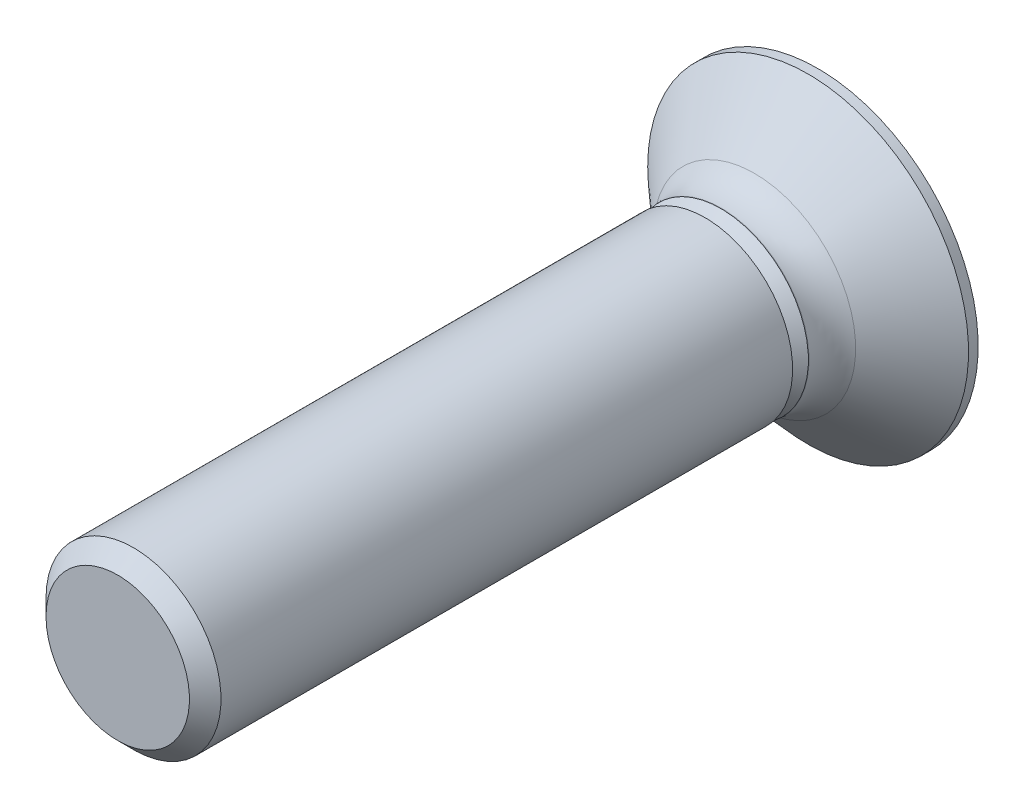
ISO-10303-21;
HEADER;
FILE_DESCRIPTION(('STEP AP214'),'2;1');
FILE_NAME('part.step','',(''),(''),'','','');
FILE_SCHEMA(('AUTOMOTIVE_DESIGN { 1 0 10303 214 1 1 1 1 }'));
ENDSEC;
DATA;
#1=APPLICATION_CONTEXT('core data for automotive mechanical design processes');
#2=APPLICATION_PROTOCOL_DEFINITION('international standard','automotive_design',2000,#1);
#3=PRODUCT_CONTEXT('',#1,'mechanical');
#4=PRODUCT('Part','Part','',(#3));
#5=PRODUCT_RELATED_PRODUCT_CATEGORY('part','',(#4));
#6=PRODUCT_DEFINITION_FORMATION('','',#4);
#7=PRODUCT_DEFINITION_CONTEXT('part definition',#1,'design');
#8=PRODUCT_DEFINITION('design','',#6,#7);
#9=PRODUCT_DEFINITION_SHAPE('','',#8);
#10=(LENGTH_UNIT() NAMED_UNIT(*) SI_UNIT(.MILLI.,.METRE.));
#11=(NAMED_UNIT(*) PLANE_ANGLE_UNIT() SI_UNIT($,.RADIAN.));
#12=(NAMED_UNIT(*) SI_UNIT($,.STERADIAN.) SOLID_ANGLE_UNIT());
#13=UNCERTAINTY_MEASURE_WITH_UNIT(LENGTH_MEASURE(1.E-05),#10,'distance_accuracy_value','');
#14=(GEOMETRIC_REPRESENTATION_CONTEXT(3) GLOBAL_UNCERTAINTY_ASSIGNED_CONTEXT((#13)) GLOBAL_UNIT_ASSIGNED_CONTEXT((#10,
#11,#12)) REPRESENTATION_CONTEXT('',''));
#15=CARTESIAN_POINT('',(0.,0.,0.));
#16=DIRECTION('',(0.,0.,1.));
#17=DIRECTION('',(1.,0.,0.));
#18=AXIS2_PLACEMENT_3D('',#15,#16,#17);
#19=CARTESIAN_POINT('',(0.,2.75,0.));
#20=DIRECTION('',(0.,0.,1.));
#21=DIRECTION('',(1.,0.,0.));
#22=AXIS2_PLACEMENT_3D('',#19,#20,#21);
#23=PLANE('',#22);
#24=CARTESIAN_POINT('',(0.,0.,0.));
#25=DIRECTION('',(0.,0.,-1.));
#26=DIRECTION('',(-1.,0.,0.));
#27=AXIS2_PLACEMENT_3D('',#24,#25,#26);
#28=CIRCLE('',#27,2.75);
#29=CARTESIAN_POINT('',(-2.75,0.,0.));
#30=VERTEX_POINT('',#29);
#31=EDGE_CURVE('E236',#30,#30,#28,.T.);
#32=ORIENTED_EDGE('',*,*,#31,.T.);
#33=EDGE_LOOP('',(#32));
#34=FACE_BOUND('',#33,.T.);
#35=DIRECTION('',(0.422618261740699,0.90630778703665,0.));
#36=VECTOR('',#35,1.);
#37=CARTESIAN_POINT('',(0.266666666666666,-1.6,0.));
#38=LINE('',#37,#36);
#39=CARTESIAN_POINT('',(0.266666666666666,-1.6,0.));
#40=VERTEX_POINT('',#39);
#41=CARTESIAN_POINT('',(0.690686510489199,-0.690686510489199,0.));
#42=VERTEX_POINT('',#41);
#43=EDGE_CURVE('E31',#40,#42,#38,.T.);
#44=ORIENTED_EDGE('',*,*,#43,.T.);
#45=DIRECTION('',(0.90630778703665,0.422618261740699,0.));
#46=VECTOR('',#45,1.);
#47=CARTESIAN_POINT('',(0.690686510489199,-0.690686510489199,0.));
#48=LINE('',#47,#46);
#49=CARTESIAN_POINT('',(1.6,-0.266666666666667,0.));
#50=VERTEX_POINT('',#49);
#51=EDGE_CURVE('E162',#42,#50,#48,.T.);
#52=ORIENTED_EDGE('',*,*,#51,.T.);
#53=DIRECTION('',(0.,1.,0.));
#54=VECTOR('',#53,1.);
#55=CARTESIAN_POINT('',(1.6,-0.266666666666667,0.));
#56=LINE('',#55,#54);
#57=CARTESIAN_POINT('',(1.6,0.266666666666666,0.));
#58=VERTEX_POINT('',#57);
#59=EDGE_CURVE('E158',#50,#58,#56,.T.);
#60=ORIENTED_EDGE('',*,*,#59,.T.);
#61=DIRECTION('',(-0.90630778703665,0.422618261740699,0.));
#62=VECTOR('',#61,1.);
#63=CARTESIAN_POINT('',(1.6,0.266666666666666,0.));
#64=LINE('',#63,#62);
#65=CARTESIAN_POINT('',(0.690686510489199,0.690686510489198,0.));
#66=VERTEX_POINT('',#65);
#67=EDGE_CURVE('E154',#58,#66,#64,.T.);
#68=ORIENTED_EDGE('',*,*,#67,.T.);
#69=DIRECTION('',(-0.422618261740699,0.90630778703665,0.));
#70=VECTOR('',#69,1.);
#71=CARTESIAN_POINT('',(0.690686510489199,0.690686510489198,0.));
#72=LINE('',#71,#70);
#73=CARTESIAN_POINT('',(0.266666666666667,1.6,0.));
#74=VERTEX_POINT('',#73);
#75=EDGE_CURVE('E150',#66,#74,#72,.T.);
#76=ORIENTED_EDGE('',*,*,#75,.T.);
#77=DIRECTION('',(-1.,0.,0.));
#78=VECTOR('',#77,1.);
#79=CARTESIAN_POINT('',(0.266666666666667,1.6,0.));
#80=LINE('',#79,#78);
#81=CARTESIAN_POINT('',(-0.266666666666666,1.6,0.));
#82=VERTEX_POINT('',#81);
#83=EDGE_CURVE('E146',#74,#82,#80,.T.);
#84=ORIENTED_EDGE('',*,*,#83,.T.);
#85=DIRECTION('',(-0.422618261740699,-0.90630778703665,0.));
#86=VECTOR('',#85,1.);
#87=CARTESIAN_POINT('',(-0.266666666666666,1.6,0.));
#88=LINE('',#87,#86);
#89=CARTESIAN_POINT('',(-0.690686510489197,0.690686510489199,0.));
#90=VERTEX_POINT('',#89);
#91=EDGE_CURVE('E142',#82,#90,#88,.T.);
#92=ORIENTED_EDGE('',*,*,#91,.T.);
#93=DIRECTION('',(-0.90630778703665,-0.422618261740699,0.));
#94=VECTOR('',#93,1.);
#95=CARTESIAN_POINT('',(-0.690686510489197,0.690686510489199,0.));
#96=LINE('',#95,#94);
#97=CARTESIAN_POINT('',(-1.6,0.266666666666667,0.));
#98=VERTEX_POINT('',#97);
#99=EDGE_CURVE('E138',#90,#98,#96,.T.);
#100=ORIENTED_EDGE('',*,*,#99,.T.);
#101=DIRECTION('',(0.,-1.,0.));
#102=VECTOR('',#101,1.);
#103=CARTESIAN_POINT('',(-1.6,0.266666666666667,0.));
#104=LINE('',#103,#102);
#105=CARTESIAN_POINT('',(-1.6,-0.266666666666666,0.));
#106=VERTEX_POINT('',#105);
#107=EDGE_CURVE('E133',#98,#106,#104,.T.);
#108=ORIENTED_EDGE('',*,*,#107,.T.);
#109=DIRECTION('',(0.90630778703665,-0.422618261740699,0.));
#110=VECTOR('',#109,1.);
#111=CARTESIAN_POINT('',(-1.6,-0.266666666666666,0.));
#112=LINE('',#111,#110);
#113=CARTESIAN_POINT('',(-0.690686510489199,-0.690686510489198,0.));
#114=VERTEX_POINT('',#113);
#115=EDGE_CURVE('E127',#106,#114,#112,.T.);
#116=ORIENTED_EDGE('',*,*,#115,.T.);
#117=DIRECTION('',(0.4226182617407,-0.90630778703665,0.));
#118=VECTOR('',#117,1.);
#119=CARTESIAN_POINT('',(-0.690686510489199,-0.690686510489198,0.));
#120=LINE('',#119,#118);
#121=CARTESIAN_POINT('',(-0.266666666666666,-1.6,0.));
#122=VERTEX_POINT('',#121);
#123=EDGE_CURVE('E110',#114,#122,#120,.T.);
#124=ORIENTED_EDGE('',*,*,#123,.T.);
#125=DIRECTION('',(1.,0.,0.));
#126=VECTOR('',#125,1.);
#127=CARTESIAN_POINT('',(-0.266666666666666,-1.6,0.));
#128=LINE('',#127,#126);
#129=EDGE_CURVE('E119',#122,#40,#128,.T.);
#130=ORIENTED_EDGE('',*,*,#129,.T.);
#131=EDGE_LOOP('',(#44,#52,#60,#68,#76,#84,#92,#100,#108,#116,#124,#130));
#132=FACE_BOUND('',#131,.T.);
#133=ADVANCED_FACE('F16',(#34,#132),#23,.F.);
#134=CARTESIAN_POINT('',(0.,0.,12.));
#135=DIRECTION('',(0.,0.,-1.));
#136=DIRECTION('',(-1.,0.,0.));
#137=AXIS2_PLACEMENT_3D('',#134,#135,#136);
#138=PLANE('',#137);
#139=CARTESIAN_POINT('',(0.,0.,12.));
#140=DIRECTION('',(0.,0.,-1.));
#141=DIRECTION('',(-1.,0.,0.));
#142=AXIS2_PLACEMENT_3D('',#139,#140,#141);
#143=CIRCLE('',#142,1.229375);
#144=CARTESIAN_POINT('',(-1.229375,0.,12.));
#145=VERTEX_POINT('',#144);
#146=EDGE_CURVE('E11',#145,#145,#143,.T.);
#147=ORIENTED_EDGE('',*,*,#146,.F.);
#148=EDGE_LOOP('',(#147));
#149=FACE_BOUND('',#148,.T.);
#150=ADVANCED_FACE('F275',(#149),#138,.F.);
#151=CARTESIAN_POINT('',(0.,0.,12.));
#152=DIRECTION('',(0.,0.,-1.));
#153=DIRECTION('',(-1.,0.,0.));
#154=AXIS2_PLACEMENT_3D('',#151,#152,#153);
#155=CONICAL_SURFACE('',#154,1.229375,0.785398163397449);
#156=CARTESIAN_POINT('',(0.,0.,11.729375));
#157=DIRECTION('',(0.,0.,-1.));
#158=DIRECTION('',(-1.,0.,0.));
#159=AXIS2_PLACEMENT_3D('',#156,#157,#158);
#160=CIRCLE('',#159,1.5);
#161=CARTESIAN_POINT('',(-1.5,0.,11.729375));
#162=VERTEX_POINT('',#161);
#163=EDGE_CURVE('E24',#162,#162,#160,.T.);
#164=ORIENTED_EDGE('',*,*,#163,.F.);
#165=EDGE_LOOP('',(#164));
#166=FACE_BOUND('',#165,.T.);
#167=ORIENTED_EDGE('',*,*,#146,.T.);
#168=EDGE_LOOP('',(#167));
#169=FACE_BOUND('',#168,.T.);
#170=ADVANCED_FACE('F272',(#166,#169),#155,.T.);
#171=CARTESIAN_POINT('',(0.,0.,0.));
#172=DIRECTION('',(0.,0.,-1.));
#173=DIRECTION('',(-1.,0.,0.));
#174=AXIS2_PLACEMENT_3D('',#171,#172,#173);
#175=CYLINDRICAL_SURFACE('',#174,1.5);
#176=CARTESIAN_POINT('',(0.,0.,1.930625));
#177=DIRECTION('',(0.,0.,-1.));
#178=DIRECTION('',(-1.,0.,0.));
#179=AXIS2_PLACEMENT_3D('',#176,#177,#178);
#180=CIRCLE('',#179,1.5);
#181=CARTESIAN_POINT('',(-1.5,0.,1.930625));
#182=VERTEX_POINT('',#181);
#183=EDGE_CURVE('E260',#182,#182,#180,.T.);
#184=ORIENTED_EDGE('',*,*,#183,.F.);
#185=EDGE_LOOP('',(#184));
#186=FACE_BOUND('',#185,.T.);
#187=ORIENTED_EDGE('',*,*,#163,.T.);
#188=EDGE_LOOP('',(#187));
#189=FACE_BOUND('',#188,.T.);
#190=ADVANCED_FACE('F270',(#186,#189),#175,.T.);
#191=CARTESIAN_POINT('',(0.,1.5,1.930625));
#192=DIRECTION('',(0.,0.,1.));
#193=DIRECTION('',(1.,0.,0.));
#194=AXIS2_PLACEMENT_3D('',#191,#192,#193);
#195=PLANE('',#194);
#196=CARTESIAN_POINT('',(0.,0.,1.930625));
#197=DIRECTION('',(0.,0.,-1.));
#198=DIRECTION('',(-1.,0.,0.));
#199=AXIS2_PLACEMENT_3D('',#196,#197,#198);
#200=CIRCLE('',#199,1.229375);
#201=CARTESIAN_POINT('',(-1.229375,0.,1.930625));
#202=VERTEX_POINT('',#201);
#203=EDGE_CURVE('E256',#202,#202,#200,.T.);
#204=ORIENTED_EDGE('',*,*,#203,.F.);
#205=EDGE_LOOP('',(#204));
#206=FACE_BOUND('',#205,.T.);
#207=ORIENTED_EDGE('',*,*,#183,.T.);
#208=EDGE_LOOP('',(#207));
#209=FACE_BOUND('',#208,.T.);
#210=ADVANCED_FACE('F288',(#206,#209),#195,.F.);
#211=CARTESIAN_POINT('',(0.,0.,1.930625));
#212=DIRECTION('',(0.,0.,-1.));
#213=DIRECTION('',(-1.,0.,0.));
#214=AXIS2_PLACEMENT_3D('',#211,#212,#213);
#215=CONICAL_SURFACE('',#214,1.229375,0.785398163397449);
#216=CARTESIAN_POINT('',(0.,0.,1.66));
#217=DIRECTION('',(0.,0.,-1.));
#218=DIRECTION('',(-1.,0.,0.));
#219=AXIS2_PLACEMENT_3D('',#216,#217,#218);
#220=CIRCLE('',#219,1.5);
#221=CARTESIAN_POINT('',(-1.5,0.,1.66));
#222=VERTEX_POINT('',#221);
#223=EDGE_CURVE('E252',#222,#222,#220,.T.);
#224=ORIENTED_EDGE('',*,*,#223,.F.);
#225=EDGE_LOOP('',(#224));
#226=FACE_BOUND('',#225,.T.);
#227=ORIENTED_EDGE('',*,*,#203,.T.);
#228=EDGE_LOOP('',(#227));
#229=FACE_BOUND('',#228,.T.);
#230=ADVANCED_FACE('F292',(#226,#229),#215,.T.);
#231=CARTESIAN_POINT('',(0.,0.,0.));
#232=DIRECTION('',(0.,0.,-1.));
#233=DIRECTION('',(-1.,0.,0.));
#234=AXIS2_PLACEMENT_3D('',#231,#232,#233);
#235=CYLINDRICAL_SURFACE('',#234,1.5);
#236=CARTESIAN_POINT('',(0.,0.,1.65));
#237=DIRECTION('',(0.,0.,-1.));
#238=DIRECTION('',(-1.,0.,0.));
#239=AXIS2_PLACEMENT_3D('',#236,#237,#238);
#240=CIRCLE('',#239,1.5);
#241=CARTESIAN_POINT('',(-1.5,0.,1.65));
#242=VERTEX_POINT('',#241);
#243=EDGE_CURVE('E248',#242,#242,#240,.T.);
#244=ORIENTED_EDGE('',*,*,#243,.F.);
#245=EDGE_LOOP('',(#244));
#246=FACE_BOUND('',#245,.T.);
#247=ORIENTED_EDGE('',*,*,#223,.T.);
#248=EDGE_LOOP('',(#247));
#249=FACE_BOUND('',#248,.T.);
#250=ADVANCED_FACE('F296',(#246,#249),#235,.T.);
#251=CARTESIAN_POINT('',(0.,0.,1.65));
#252=DIRECTION('',(0.,0.,-1.));
#253=DIRECTION('',(-1.,0.,0.));
#254=AXIS2_PLACEMENT_3D('',#251,#252,#253);
#255=TOROIDAL_SURFACE('',#254,2.3,0.8);
#256=ORIENTED_EDGE('',*,*,#243,.T.);
#257=EDGE_LOOP('',(#256));
#258=FACE_BOUND('',#257,.T.);
#259=CARTESIAN_POINT('',(0.,0.,1.08431457505076));
#260=DIRECTION('',(0.,0.,-1.));
#261=DIRECTION('',(-1.,0.,0.));
#262=AXIS2_PLACEMENT_3D('',#259,#260,#261);
#263=CIRCLE('',#262,1.73431457505076);
#264=CARTESIAN_POINT('',(-1.73431457505076,0.,1.08431457505076));
#265=VERTEX_POINT('',#264);
#266=EDGE_CURVE('E244',#265,#265,#263,.T.);
#267=ORIENTED_EDGE('',*,*,#266,.F.);
#268=EDGE_LOOP('',(#267));
#269=FACE_BOUND('',#268,.T.);
#270=ADVANCED_FACE('F300',(#258,#269),#255,.F.);
#271=CARTESIAN_POINT('',(0.,0.,1.08431457505076));
#272=DIRECTION('',(0.,0.,-1.));
#273=DIRECTION('',(-1.,0.,0.));
#274=AXIS2_PLACEMENT_3D('',#271,#272,#273);
#275=CONICAL_SURFACE('',#274,1.73431457505076,0.835161102643237);
#276=CARTESIAN_POINT('',(0.,0.,0.165));
#277=DIRECTION('',(0.,0.,-1.));
#278=DIRECTION('',(-1.,0.,0.));
#279=AXIS2_PLACEMENT_3D('',#276,#277,#278);
#280=CIRCLE('',#279,2.75);
#281=CARTESIAN_POINT('',(-2.75,0.,0.165));
#282=VERTEX_POINT('',#281);
#283=EDGE_CURVE('E240',#282,#282,#280,.T.);
#284=ORIENTED_EDGE('',*,*,#283,.F.);
#285=EDGE_LOOP('',(#284));
#286=FACE_BOUND('',#285,.T.);
#287=ORIENTED_EDGE('',*,*,#266,.T.);
#288=EDGE_LOOP('',(#287));
#289=FACE_BOUND('',#288,.T.);
#290=ADVANCED_FACE('F304',(#286,#289),#275,.T.);
#291=CARTESIAN_POINT('',(0.,0.,0.));
#292=DIRECTION('',(0.,0.,-1.));
#293=DIRECTION('',(-1.,0.,0.));
#294=AXIS2_PLACEMENT_3D('',#291,#292,#293);
#295=CYLINDRICAL_SURFACE('',#294,2.75);
#296=ORIENTED_EDGE('',*,*,#31,.F.);
#297=EDGE_LOOP('',(#296));
#298=FACE_BOUND('',#297,.T.);
#299=ORIENTED_EDGE('',*,*,#283,.T.);
#300=EDGE_LOOP('',(#299));
#301=FACE_BOUND('',#300,.T.);
#302=ADVANCED_FACE('F308',(#298,#301),#295,.T.);
#303=CARTESIAN_POINT('',(0.266666666666666,-1.6,0.));
#304=DIRECTION('',(-0.875426098065593,0.408217893676735,-0.258819045102521));
#305=DIRECTION('',(-0.422618261740699,-0.90630778703665,0.));
#306=AXIS2_PLACEMENT_3D('',#303,#304,#305);
#307=PLANE('',#306);
#308=DIRECTION('',(0.422618261740699,0.90630778703665,0.));
#309=VECTOR('',#308,1.);
#310=CARTESIAN_POINT('',(0.0311291837482248,-1.02727469648858,1.7));
#311=LINE('',#310,#309);
#312=CARTESIAN_POINT('',(0.,-1.09403144646646,1.7));
#313=VERTEX_POINT('',#312);
#314=CARTESIAN_POINT('',(0.347918282300735,-0.347918282300735,1.7));
#315=VERTEX_POINT('',#314);
#316=EDGE_CURVE('E123',#313,#315,#311,.T.);
#317=ORIENTED_EDGE('',*,*,#316,.T.);
#318=DIRECTION('',(0.193899607686987,-0.193899607686987,-0.961668281829896));
#319=VECTOR('',#318,1.);
#320=CARTESIAN_POINT('',(0.708932123765797,-0.708932123765797,-0.0904913000080147));
#321=LINE('',#320,#319);
#322=EDGE_CURVE('E197',#315,#42,#321,.T.);
#323=ORIENTED_EDGE('',*,*,#322,.T.);
#324=ORIENTED_EDGE('',*,*,#43,.F.);
#325=DIRECTION('',(0.162689201767992,-0.255370893567974,-0.953057149569945));
#326=VECTOR('',#325,1.);
#327=CARTESIAN_POINT('',(0.266666666666666,-1.6,0.));
#328=LINE('',#327,#326);
#329=CARTESIAN_POINT('',(0.,-1.18141717943534,1.56217235352282));
#330=VERTEX_POINT('',#329);
#331=EDGE_CURVE('E116',#330,#40,#328,.T.);
#332=ORIENTED_EDGE('',*,*,#331,.F.);
#333=DIRECTION('',(0.,-0.535467009821226,-0.844556144606808));
#334=VECTOR('',#333,1.);
#335=CARTESIAN_POINT('',(0.,-2.00789955953988,0.25861721431901));
#336=LINE('',#335,#334);
#337=EDGE_CURVE('E37',#313,#330,#336,.T.);
#338=ORIENTED_EDGE('',*,*,#337,.F.);
#339=EDGE_LOOP('',(#317,#323,#324,#332,#338));
#340=FACE_BOUND('',#339,.T.);
#341=ADVANCED_FACE('F312',(#340),#307,.T.);
#342=CARTESIAN_POINT('',(0.690686510489199,-0.690686510489199,0.));
#343=DIRECTION('',(-0.408217893676735,0.875426098065593,-0.258819045102521));
#344=DIRECTION('',(-0.90630778703665,-0.422618261740699,0.));
#345=AXIS2_PLACEMENT_3D('',#342,#343,#344);
#346=PLANE('',#345);
#347=DIRECTION('',(0.535467009821226,0.,-0.844556144606808));
#348=VECTOR('',#347,1.);
#349=CARTESIAN_POINT('',(2.00789955953988,0.,0.25861721431901));
#350=LINE('',#349,#348);
#351=CARTESIAN_POINT('',(1.09403144646646,0.,1.7));
#352=VERTEX_POINT('',#351);
#353=CARTESIAN_POINT('',(1.18141717943534,0.,1.56217235352282));
#354=VERTEX_POINT('',#353);
#355=EDGE_CURVE('E227',#352,#354,#350,.T.);
#356=ORIENTED_EDGE('',*,*,#355,.T.);
#357=DIRECTION('',(0.255370893567974,-0.162689201767992,-0.953057149569945));
#358=VECTOR('',#357,1.);
#359=CARTESIAN_POINT('',(1.6,-0.266666666666667,0.));
#360=LINE('',#359,#358);
#361=EDGE_CURVE('E194',#354,#50,#360,.T.);
#362=ORIENTED_EDGE('',*,*,#361,.T.);
#363=ORIENTED_EDGE('',*,*,#51,.F.);
#364=ORIENTED_EDGE('',*,*,#322,.F.);
#365=DIRECTION('',(0.90630778703665,0.422618261740699,0.));
#366=VECTOR('',#365,1.);
#367=CARTESIAN_POINT('',(0.0928666510036984,-0.466850811199468,1.7));
#368=LINE('',#367,#366);
#369=EDGE_CURVE('E202',#315,#352,#368,.T.);
#370=ORIENTED_EDGE('',*,*,#369,.T.);
#371=EDGE_LOOP('',(#356,#362,#363,#364,#370));
#372=FACE_BOUND('',#371,.T.);
#373=ADVANCED_FACE('F316',(#372),#346,.T.);
#374=CARTESIAN_POINT('',(1.6,-0.266666666666667,0.));
#375=DIRECTION('',(-0.965925826289068,0.,-0.258819045102521));
#376=DIRECTION('',(-0.258819045102521,0.,0.965925826289068));
#377=AXIS2_PLACEMENT_3D('',#374,#375,#376);
#378=PLANE('',#377);
#379=ORIENTED_EDGE('',*,*,#59,.F.);
#380=ORIENTED_EDGE('',*,*,#361,.F.);
#381=DIRECTION('',(0.255370893567974,0.162689201767992,-0.953057149569945));
#382=VECTOR('',#381,1.);
#383=CARTESIAN_POINT('',(1.6,0.266666666666666,0.));
#384=LINE('',#383,#382);
#385=EDGE_CURVE('E191',#354,#58,#384,.T.);
#386=ORIENTED_EDGE('',*,*,#385,.T.);
#387=EDGE_LOOP('',(#379,#380,#386));
#388=FACE_BOUND('',#387,.T.);
#389=ADVANCED_FACE('F319',(#388),#378,.T.);
#390=CARTESIAN_POINT('',(1.6,0.266666666666666,0.));
#391=DIRECTION('',(-0.408217893676735,-0.875426098065593,-0.258819045102521));
#392=DIRECTION('',(0.90630778703665,-0.422618261740699,0.));
#393=AXIS2_PLACEMENT_3D('',#390,#391,#392);
#394=PLANE('',#393);
#395=DIRECTION('',(-0.90630778703665,0.422618261740699,0.));
#396=VECTOR('',#395,1.);
#397=CARTESIAN_POINT('',(1.02727469648858,0.0311291837482241,1.7));
#398=LINE('',#397,#396);
#399=CARTESIAN_POINT('',(0.347918282300735,0.347918282300735,1.7));
#400=VERTEX_POINT('',#399);
#401=EDGE_CURVE('E206',#352,#400,#398,.T.);
#402=ORIENTED_EDGE('',*,*,#401,.T.);
#403=DIRECTION('',(0.193899607686987,0.193899607686987,-0.961668281829896));
#404=VECTOR('',#403,1.);
#405=CARTESIAN_POINT('',(0.708932123765798,0.708932123765797,-0.0904913000080147));
#406=LINE('',#405,#404);
#407=EDGE_CURVE('E188',#400,#66,#406,.T.);
#408=ORIENTED_EDGE('',*,*,#407,.T.);
#409=ORIENTED_EDGE('',*,*,#67,.F.);
#410=ORIENTED_EDGE('',*,*,#385,.F.);
#411=ORIENTED_EDGE('',*,*,#355,.F.);
#412=EDGE_LOOP('',(#402,#408,#409,#410,#411));
#413=FACE_BOUND('',#412,.T.);
#414=ADVANCED_FACE('F323',(#413),#394,.T.);
#415=CARTESIAN_POINT('',(0.690686510489199,0.690686510489198,0.));
#416=DIRECTION('',(-0.875426098065593,-0.408217893676735,-0.258819045102521));
#417=DIRECTION('',(0.422618261740699,-0.90630778703665,0.));
#418=AXIS2_PLACEMENT_3D('',#415,#416,#417);
#419=PLANE('',#418);
#420=DIRECTION('',(0.,0.535467009821226,-0.844556144606808));
#421=VECTOR('',#420,1.);
#422=CARTESIAN_POINT('',(0.,2.00789955953988,0.25861721431901));
#423=LINE('',#422,#421);
#424=CARTESIAN_POINT('',(0.,1.09403144646646,1.7));
#425=VERTEX_POINT('',#424);
#426=CARTESIAN_POINT('',(0.,1.18141717943534,1.56217235352282));
#427=VERTEX_POINT('',#426);
#428=EDGE_CURVE('E230',#425,#427,#423,.T.);
#429=ORIENTED_EDGE('',*,*,#428,.T.);
#430=DIRECTION('',(0.162689201767992,0.255370893567974,-0.953057149569945));
#431=VECTOR('',#430,1.);
#432=CARTESIAN_POINT('',(0.266666666666667,1.6,0.));
#433=LINE('',#432,#431);
#434=EDGE_CURVE('E185',#427,#74,#433,.T.);
#435=ORIENTED_EDGE('',*,*,#434,.T.);
#436=ORIENTED_EDGE('',*,*,#75,.F.);
#437=ORIENTED_EDGE('',*,*,#407,.F.);
#438=DIRECTION('',(-0.422618261740699,0.90630778703665,0.));
#439=VECTOR('',#438,1.);
#440=CARTESIAN_POINT('',(0.965537229233103,-0.976569823633555,1.7));
#441=LINE('',#440,#439);
#442=EDGE_CURVE('E209',#400,#425,#441,.T.);
#443=ORIENTED_EDGE('',*,*,#442,.T.);
#444=EDGE_LOOP('',(#429,#435,#436,#437,#443));
#445=FACE_BOUND('',#444,.T.);
#446=ADVANCED_FACE('F327',(#445),#419,.T.);
#447=CARTESIAN_POINT('',(0.266666666666667,1.6,0.));
#448=DIRECTION('',(0.,-0.965925826289068,-0.258819045102521));
#449=DIRECTION('',(0.,0.258819045102521,-0.965925826289068));
#450=AXIS2_PLACEMENT_3D('',#447,#448,#449);
#451=PLANE('',#450);
#452=ORIENTED_EDGE('',*,*,#83,.F.);
#453=ORIENTED_EDGE('',*,*,#434,.F.);
#454=DIRECTION('',(-0.162689201767992,0.255370893567974,-0.953057149569945));
#455=VECTOR('',#454,1.);
#456=CARTESIAN_POINT('',(-0.266666666666666,1.6,0.));
#457=LINE('',#456,#455);
#458=EDGE_CURVE('E182',#427,#82,#457,.T.);
#459=ORIENTED_EDGE('',*,*,#458,.T.);
#460=EDGE_LOOP('',(#452,#453,#459));
#461=FACE_BOUND('',#460,.T.);
#462=ADVANCED_FACE('F331',(#461),#451,.T.);
#463=CARTESIAN_POINT('',(-0.266666666666666,1.6,0.));
#464=DIRECTION('',(0.875426098065593,-0.408217893676735,-0.258819045102521));
#465=DIRECTION('',(0.422618261740699,0.90630778703665,0.));
#466=AXIS2_PLACEMENT_3D('',#463,#464,#465);
#467=PLANE('',#466);
#468=DIRECTION('',(-0.422618261740699,-0.90630778703665,0.));
#469=VECTOR('',#468,1.);
#470=CARTESIAN_POINT('',(-0.806947526414821,-0.636473108418201,1.7));
#471=LINE('',#470,#469);
#472=CARTESIAN_POINT('',(-0.347918282300733,0.347918282300735,1.7));
#473=VERTEX_POINT('',#472);
#474=EDGE_CURVE('E213',#425,#473,#471,.T.);
#475=ORIENTED_EDGE('',*,*,#474,.T.);
#476=DIRECTION('',(-0.193899607686987,0.193899607686987,-0.961668281829896));
#477=VECTOR('',#476,1.);
#478=CARTESIAN_POINT('',(-0.708932123765796,0.708932123765798,-0.0904913000080149));
#479=LINE('',#478,#477);
#480=EDGE_CURVE('E179',#473,#90,#479,.T.);
#481=ORIENTED_EDGE('',*,*,#480,.T.);
#482=ORIENTED_EDGE('',*,*,#91,.F.);
#483=ORIENTED_EDGE('',*,*,#458,.F.);
#484=ORIENTED_EDGE('',*,*,#428,.F.);
#485=EDGE_LOOP('',(#475,#481,#482,#483,#484));
#486=FACE_BOUND('',#485,.T.);
#487=ADVANCED_FACE('F335',(#486),#467,.T.);
#488=CARTESIAN_POINT('',(-0.690686510489197,0.690686510489199,0.));
#489=DIRECTION('',(0.408217893676735,-0.875426098065593,-0.258819045102521));
#490=DIRECTION('',(0.90630778703665,0.422618261740699,0.));
#491=AXIS2_PLACEMENT_3D('',#488,#489,#490);
#492=PLANE('',#491);
#493=DIRECTION('',(-0.535467009821226,0.,-0.844556144606808));
#494=VECTOR('',#493,1.);
#495=CARTESIAN_POINT('',(-2.00789955953988,0.,0.25861721431901));
#496=LINE('',#495,#494);
#497=CARTESIAN_POINT('',(-1.09403144646646,0.,1.7));
#498=VERTEX_POINT('',#497);
#499=CARTESIAN_POINT('',(-1.18141717943534,0.,1.56217235352282));
#500=VERTEX_POINT('',#499);
#501=EDGE_CURVE('E233',#498,#500,#496,.T.);
#502=ORIENTED_EDGE('',*,*,#501,.T.);
#503=DIRECTION('',(-0.255370893567974,0.162689201767992,-0.953057149569945));
#504=VECTOR('',#503,1.);
#505=CARTESIAN_POINT('',(-1.6,0.266666666666667,0.));
#506=LINE('',#505,#504);
#507=EDGE_CURVE('E176',#500,#98,#506,.T.);
#508=ORIENTED_EDGE('',*,*,#507,.T.);
#509=ORIENTED_EDGE('',*,*,#99,.F.);
#510=ORIENTED_EDGE('',*,*,#480,.F.);
#511=DIRECTION('',(-0.90630778703665,-0.422618261740699,0.));
#512=VECTOR('',#511,1.);
#513=CARTESIAN_POINT('',(-0.297934937066678,0.37122589896358,1.7));
#514=LINE('',#513,#512);
#515=EDGE_CURVE('E216',#473,#498,#514,.T.);
#516=ORIENTED_EDGE('',*,*,#515,.T.);
#517=EDGE_LOOP('',(#502,#508,#509,#510,#516));
#518=FACE_BOUND('',#517,.T.);
#519=ADVANCED_FACE('F339',(#518),#492,.T.);
#520=CARTESIAN_POINT('',(-1.6,0.266666666666667,0.));
#521=DIRECTION('',(0.965925826289068,0.,-0.258819045102521));
#522=DIRECTION('',(-0.258819045102521,0.,-0.965925826289068));
#523=AXIS2_PLACEMENT_3D('',#520,#521,#522);
#524=PLANE('',#523);
#525=ORIENTED_EDGE('',*,*,#107,.F.);
#526=ORIENTED_EDGE('',*,*,#507,.F.);
#527=DIRECTION('',(-0.255370893567974,-0.162689201767992,-0.953057149569945));
#528=VECTOR('',#527,1.);
#529=CARTESIAN_POINT('',(-1.6,-0.266666666666666,0.));
#530=LINE('',#529,#528);
#531=EDGE_CURVE('E173',#500,#106,#530,.T.);
#532=ORIENTED_EDGE('',*,*,#531,.T.);
#533=EDGE_LOOP('',(#525,#526,#532));
#534=FACE_BOUND('',#533,.T.);
#535=ADVANCED_FACE('F343',(#534),#524,.T.);
#536=CARTESIAN_POINT('',(-1.6,-0.266666666666666,0.));
#537=DIRECTION('',(0.408217893676735,0.875426098065593,-0.258819045102521));
#538=DIRECTION('',(-0.90630778703665,0.422618261740699,0.));
#539=AXIS2_PLACEMENT_3D('',#536,#537,#538);
#540=PLANE('',#539);
#541=DIRECTION('',(0.90630778703665,-0.422618261740699,0.));
#542=VECTOR('',#541,1.);
#543=CARTESIAN_POINT('',(0.6364731084182,-0.806947526414823,1.7));
#544=LINE('',#543,#542);
#545=CARTESIAN_POINT('',(-0.347918282300735,-0.347918282300734,1.7));
#546=VERTEX_POINT('',#545);
#547=EDGE_CURVE('E220',#498,#546,#544,.T.);
#548=ORIENTED_EDGE('',*,*,#547,.T.);
#549=DIRECTION('',(-0.193899607686987,-0.193899607686987,-0.961668281829896));
#550=VECTOR('',#549,1.);
#551=CARTESIAN_POINT('',(-0.708932123765798,-0.708932123765797,-0.0904913000080147));
#552=LINE('',#551,#550);
#553=EDGE_CURVE('E115',#546,#114,#552,.T.);
#554=ORIENTED_EDGE('',*,*,#553,.T.);
#555=ORIENTED_EDGE('',*,*,#115,.F.);
#556=ORIENTED_EDGE('',*,*,#531,.F.);
#557=ORIENTED_EDGE('',*,*,#501,.F.);
#558=EDGE_LOOP('',(#548,#554,#555,#556,#557));
#559=FACE_BOUND('',#558,.T.);
#560=ADVANCED_FACE('F347',(#559),#540,.T.);
#561=CARTESIAN_POINT('',(-0.690686510489199,-0.690686510489198,0.));
#562=DIRECTION('',(0.875426098065593,0.408217893676735,-0.258819045102521));
#563=DIRECTION('',(-0.422618261740699,0.90630778703665,0.));
#564=AXIS2_PLACEMENT_3D('',#561,#562,#563);
#565=PLANE('',#564);
#566=ORIENTED_EDGE('',*,*,#337,.T.);
#567=DIRECTION('',(-0.162689201767992,-0.255370893567974,-0.953057149569945));
#568=VECTOR('',#567,1.);
#569=CARTESIAN_POINT('',(-0.266666666666666,-1.6,0.));
#570=LINE('',#569,#568);
#571=EDGE_CURVE('E105',#330,#122,#570,.T.);
#572=ORIENTED_EDGE('',*,*,#571,.T.);
#573=ORIENTED_EDGE('',*,*,#123,.F.);
#574=ORIENTED_EDGE('',*,*,#553,.F.);
#575=DIRECTION('',(0.422618261740699,-0.90630778703665,0.));
#576=VECTOR('',#575,1.);
#577=CARTESIAN_POINT('',(0.127460519070055,-1.36737141170393,1.7));
#578=LINE('',#577,#576);
#579=EDGE_CURVE('E169',#546,#313,#578,.T.);
#580=ORIENTED_EDGE('',*,*,#579,.T.);
#581=EDGE_LOOP('',(#566,#572,#573,#574,#580));
#582=FACE_BOUND('',#581,.T.);
#583=ADVANCED_FACE('F107',(#582),#565,.T.);
#584=CARTESIAN_POINT('',(-0.266666666666666,-1.6,0.));
#585=DIRECTION('',(0.,0.965925826289068,-0.258819045102521));
#586=DIRECTION('',(0.,0.258819045102521,0.965925826289068));
#587=AXIS2_PLACEMENT_3D('',#584,#585,#586);
#588=PLANE('',#587);
#589=ORIENTED_EDGE('',*,*,#129,.F.);
#590=ORIENTED_EDGE('',*,*,#571,.F.);
#591=ORIENTED_EDGE('',*,*,#331,.T.);
#592=EDGE_LOOP('',(#589,#590,#591));
#593=FACE_BOUND('',#592,.T.);
#594=ADVANCED_FACE('F120',(#593),#588,.T.);
#595=CARTESIAN_POINT('',(0.443964731120089,-1.21978307378669,1.7));
#596=DIRECTION('',(0.,0.,-1.));
#597=DIRECTION('',(-1.,0.,0.));
#598=AXIS2_PLACEMENT_3D('',#595,#596,#597);
#599=PLANE('',#598);
#600=ORIENTED_EDGE('',*,*,#579,.F.);
#601=ORIENTED_EDGE('',*,*,#547,.F.);
#602=ORIENTED_EDGE('',*,*,#515,.F.);
#603=ORIENTED_EDGE('',*,*,#474,.F.);
#604=ORIENTED_EDGE('',*,*,#442,.F.);
#605=ORIENTED_EDGE('',*,*,#401,.F.);
#606=ORIENTED_EDGE('',*,*,#369,.F.);
#607=ORIENTED_EDGE('',*,*,#316,.F.);
#608=EDGE_LOOP('',(#600,#601,#602,#603,#604,#605,#606,#607));
#609=FACE_BOUND('',#608,.T.);
#610=ADVANCED_FACE('F356',(#609),#599,.T.);
#611=CLOSED_SHELL('',(#133,#150,#170,#190,#210,#230,#250,#270,#290,#302,#341,#373,#389,#414,
#446,#462,#487,#519,#535,#560,#583,#594,#610));
#612=MANIFOLD_SOLID_BREP('B1',#611);
#613=ADVANCED_BREP_SHAPE_REPRESENTATION('',(#18,#612),#14);
#614=SHAPE_DEFINITION_REPRESENTATION(#9,#613);
ENDSEC;
END-ISO-10303-21;
